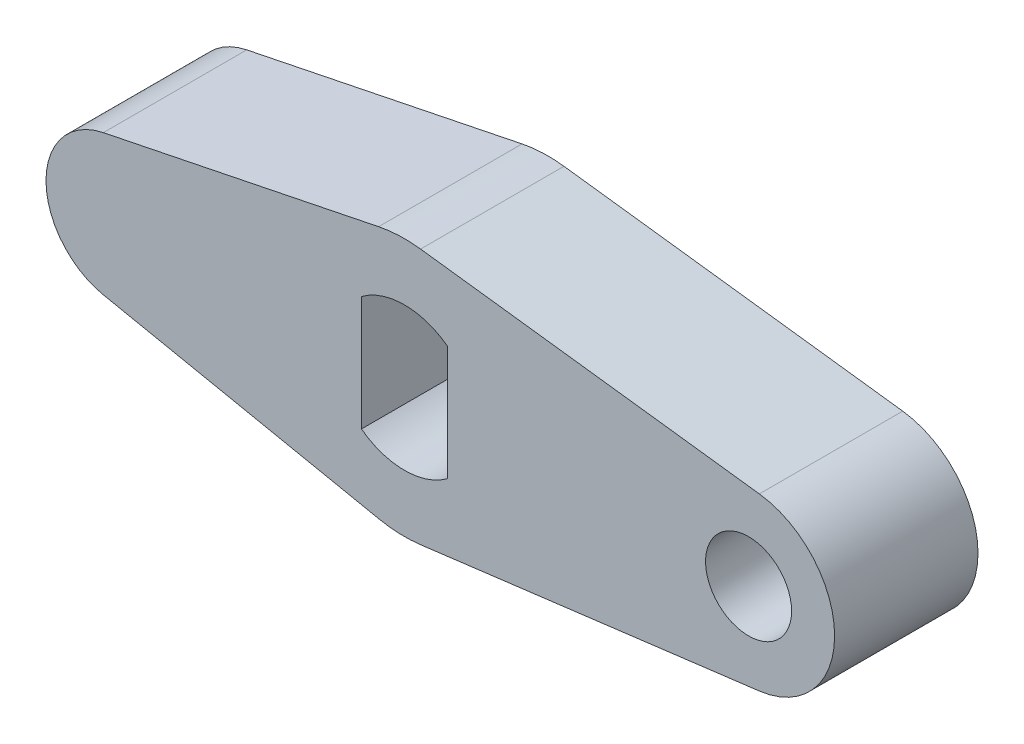
ISO-10303-21;
HEADER;
FILE_DESCRIPTION(('STEP AP214'),'2;1');
FILE_NAME('part.step','',(''),(''),'','','');
FILE_SCHEMA(('AUTOMOTIVE_DESIGN { 1 0 10303 214 1 1 1 1 }'));
ENDSEC;
DATA;
#1=APPLICATION_CONTEXT('core data for automotive mechanical design processes');
#2=APPLICATION_PROTOCOL_DEFINITION('international standard','automotive_design',2000,#1);
#3=PRODUCT_CONTEXT('',#1,'mechanical');
#4=PRODUCT('Part','Part','',(#3));
#5=PRODUCT_RELATED_PRODUCT_CATEGORY('part','',(#4));
#6=PRODUCT_DEFINITION_FORMATION('','',#4);
#7=PRODUCT_DEFINITION_CONTEXT('part definition',#1,'design');
#8=PRODUCT_DEFINITION('design','',#6,#7);
#9=PRODUCT_DEFINITION_SHAPE('','',#8);
#10=(LENGTH_UNIT() NAMED_UNIT(*) SI_UNIT(.MILLI.,.METRE.));
#11=(NAMED_UNIT(*) PLANE_ANGLE_UNIT() SI_UNIT($,.RADIAN.));
#12=(NAMED_UNIT(*) SI_UNIT($,.STERADIAN.) SOLID_ANGLE_UNIT());
#13=UNCERTAINTY_MEASURE_WITH_UNIT(LENGTH_MEASURE(1.E-05),#10,'distance_accuracy_value','');
#14=(GEOMETRIC_REPRESENTATION_CONTEXT(3) GLOBAL_UNCERTAINTY_ASSIGNED_CONTEXT((#13)) GLOBAL_UNIT_ASSIGNED_CONTEXT((#10,
#11,#12)) REPRESENTATION_CONTEXT('',''));
#15=CARTESIAN_POINT('',(0.,0.,0.));
#16=DIRECTION('',(0.,0.,1.));
#17=DIRECTION('',(1.,0.,0.));
#18=AXIS2_PLACEMENT_3D('',#15,#16,#17);
#19=CARTESIAN_POINT('',(-0.9,4.40908153700972,2.5));
#20=DIRECTION('',(0.2,-0.979795897113271,0.));
#21=DIRECTION('',(0.979795897113271,0.2,0.));
#22=AXIS2_PLACEMENT_3D('',#19,#20,#21);
#23=PLANE('',#22);
#24=DIRECTION('',(-0.979795897113271,-0.2,0.));
#25=VECTOR('',#24,1.);
#26=CARTESIAN_POINT('',(-0.9,4.40908153700972,-2.5));
#27=LINE('',#26,#25);
#28=CARTESIAN_POINT('',(-0.9,4.40908153700972,-2.5));
#29=VERTEX_POINT('',#28);
#30=CARTESIAN_POINT('',(-10.5,2.44948974278318,-2.5));
#31=VERTEX_POINT('',#30);
#32=EDGE_CURVE('E173',#29,#31,#27,.T.);
#33=ORIENTED_EDGE('',*,*,#32,.T.);
#34=DIRECTION('',(0.,0.,-1.));
#35=VECTOR('',#34,1.);
#36=CARTESIAN_POINT('',(-10.5,2.44948974278318,2.5));
#37=LINE('',#36,#35);
#38=CARTESIAN_POINT('',(-10.5,2.44948974278318,2.5));
#39=VERTEX_POINT('',#38);
#40=EDGE_CURVE('E11',#39,#31,#37,.T.);
#41=ORIENTED_EDGE('',*,*,#40,.F.);
#42=DIRECTION('',(-0.979795897113271,-0.2,0.));
#43=VECTOR('',#42,1.);
#44=CARTESIAN_POINT('',(-0.9,4.40908153700972,2.5));
#45=LINE('',#44,#43);
#46=CARTESIAN_POINT('',(-0.9,4.40908153700972,2.5));
#47=VERTEX_POINT('',#46);
#48=EDGE_CURVE('E290',#47,#39,#45,.T.);
#49=ORIENTED_EDGE('',*,*,#48,.F.);
#50=DIRECTION('',(0.,0.,-1.));
#51=VECTOR('',#50,1.);
#52=CARTESIAN_POINT('',(-0.9,4.40908153700972,2.5));
#53=LINE('',#52,#51);
#54=EDGE_CURVE('E193',#47,#29,#53,.T.);
#55=ORIENTED_EDGE('',*,*,#54,.T.);
#56=EDGE_LOOP('',(#33,#41,#49,#55));
#57=FACE_BOUND('',#56,.T.);
#58=ADVANCED_FACE('F35',(#57),#23,.F.);
#59=CARTESIAN_POINT('',(-10.,0.,2.5));
#60=DIRECTION('',(0.,0.,-1.));
#61=DIRECTION('',(-1.,0.,0.));
#62=AXIS2_PLACEMENT_3D('',#59,#60,#61);
#63=CYLINDRICAL_SURFACE('',#62,2.5);
#64=CARTESIAN_POINT('',(-10.,0.,-2.5));
#65=DIRECTION('',(0.,0.,1.));
#66=DIRECTION('',(1.,0.,0.));
#67=AXIS2_PLACEMENT_3D('',#64,#65,#66);
#68=CIRCLE('',#67,2.5);
#69=CARTESIAN_POINT('',(-10.5,-2.44948974278318,-2.5));
#70=VERTEX_POINT('',#69);
#71=EDGE_CURVE('E176',#31,#70,#68,.T.);
#72=ORIENTED_EDGE('',*,*,#71,.T.);
#73=DIRECTION('',(0.,0.,-1.));
#74=VECTOR('',#73,1.);
#75=CARTESIAN_POINT('',(-10.5,-2.44948974278318,2.5));
#76=LINE('',#75,#74);
#77=CARTESIAN_POINT('',(-10.5,-2.44948974278318,2.5));
#78=VERTEX_POINT('',#77);
#79=EDGE_CURVE('E45',#78,#70,#76,.T.);
#80=ORIENTED_EDGE('',*,*,#79,.F.);
#81=CARTESIAN_POINT('',(-10.,0.,2.5));
#82=DIRECTION('',(0.,0.,1.));
#83=DIRECTION('',(1.,0.,0.));
#84=AXIS2_PLACEMENT_3D('',#81,#82,#83);
#85=CIRCLE('',#84,2.5);
#86=EDGE_CURVE('E288',#39,#78,#85,.T.);
#87=ORIENTED_EDGE('',*,*,#86,.F.);
#88=ORIENTED_EDGE('',*,*,#40,.T.);
#89=EDGE_LOOP('',(#72,#80,#87,#88));
#90=FACE_BOUND('',#89,.T.);
#91=ADVANCED_FACE('F238',(#90),#63,.T.);
#92=CARTESIAN_POINT('',(-0.899999999999998,-4.40908153700972,2.5));
#93=DIRECTION('',(-0.2,-0.979795897113271,0.));
#94=DIRECTION('',(0.979795897113271,-0.2,0.));
#95=AXIS2_PLACEMENT_3D('',#92,#93,#94);
#96=PLANE('',#95);
#97=DIRECTION('',(-0.979795897113271,0.2,0.));
#98=VECTOR('',#97,1.);
#99=CARTESIAN_POINT('',(-0.899999999999998,-4.40908153700972,-2.5));
#100=LINE('',#99,#98);
#101=CARTESIAN_POINT('',(-0.899999999999999,-4.40908153700972,-2.5));
#102=VERTEX_POINT('',#101);
#103=EDGE_CURVE('E179',#102,#70,#100,.T.);
#104=ORIENTED_EDGE('',*,*,#103,.F.);
#105=DIRECTION('',(0.,0.,-1.));
#106=VECTOR('',#105,1.);
#107=CARTESIAN_POINT('',(-0.899999999999999,-4.40908153700972,2.5));
#108=LINE('',#107,#106);
#109=CARTESIAN_POINT('',(-0.899999999999999,-4.40908153700972,2.5));
#110=VERTEX_POINT('',#109);
#111=EDGE_CURVE('E200',#110,#102,#108,.T.);
#112=ORIENTED_EDGE('',*,*,#111,.F.);
#113=DIRECTION('',(-0.979795897113271,0.2,0.));
#114=VECTOR('',#113,1.);
#115=CARTESIAN_POINT('',(-0.899999999999998,-4.40908153700972,2.5));
#116=LINE('',#115,#114);
#117=EDGE_CURVE('E285',#110,#78,#116,.T.);
#118=ORIENTED_EDGE('',*,*,#117,.T.);
#119=ORIENTED_EDGE('',*,*,#79,.T.);
#120=EDGE_LOOP('',(#104,#112,#118,#119));
#121=FACE_BOUND('',#120,.T.);
#122=ADVANCED_FACE('F244',(#121),#96,.T.);
#123=CARTESIAN_POINT('',(0.,0.,2.5));
#124=DIRECTION('',(0.,0.,-1.));
#125=DIRECTION('',(-1.,0.,0.));
#126=AXIS2_PLACEMENT_3D('',#123,#124,#125);
#127=CYLINDRICAL_SURFACE('',#126,4.5);
#128=CARTESIAN_POINT('',(0.,0.,-2.5));
#129=DIRECTION('',(0.,0.,1.));
#130=DIRECTION('',(1.,0.,0.));
#131=AXIS2_PLACEMENT_3D('',#128,#129,#130);
#132=CIRCLE('',#131,4.5);
#133=CARTESIAN_POINT('',(0.5625,-4.4647053374215,-2.5));
#134=VERTEX_POINT('',#133);
#135=EDGE_CURVE('E182',#102,#134,#132,.T.);
#136=ORIENTED_EDGE('',*,*,#135,.T.);
#137=DIRECTION('',(0.,0.,-1.));
#138=VECTOR('',#137,1.);
#139=CARTESIAN_POINT('',(0.5625,-4.4647053374215,2.5));
#140=LINE('',#139,#138);
#141=CARTESIAN_POINT('',(0.5625,-4.4647053374215,2.5));
#142=VERTEX_POINT('',#141);
#143=EDGE_CURVE('E197',#142,#134,#140,.T.);
#144=ORIENTED_EDGE('',*,*,#143,.F.);
#145=CARTESIAN_POINT('',(0.,0.,2.5));
#146=DIRECTION('',(0.,0.,1.));
#147=DIRECTION('',(1.,0.,0.));
#148=AXIS2_PLACEMENT_3D('',#145,#146,#147);
#149=CIRCLE('',#148,4.5);
#150=EDGE_CURVE('E157',#110,#142,#149,.T.);
#151=ORIENTED_EDGE('',*,*,#150,.F.);
#152=ORIENTED_EDGE('',*,*,#111,.T.);
#153=EDGE_LOOP('',(#136,#144,#151,#152));
#154=FACE_BOUND('',#153,.T.);
#155=ADVANCED_FACE('F234',(#154),#127,.T.);
#156=CARTESIAN_POINT('',(0.5625,-4.4647053374215,2.5));
#157=DIRECTION('',(-0.125,0.992156741649222,0.));
#158=DIRECTION('',(-0.992156741649222,-0.125,0.));
#159=AXIS2_PLACEMENT_3D('',#156,#157,#158);
#160=PLANE('',#159);
#161=DIRECTION('',(0.992156741649222,0.125,0.));
#162=VECTOR('',#161,1.);
#163=CARTESIAN_POINT('',(0.5625,-4.4647053374215,-2.5));
#164=LINE('',#163,#162);
#165=CARTESIAN_POINT('',(12.375,-2.97647022494766,-2.5));
#166=VERTEX_POINT('',#165);
#167=EDGE_CURVE('E184',#134,#166,#164,.T.);
#168=ORIENTED_EDGE('',*,*,#167,.T.);
#169=DIRECTION('',(0.,0.,-1.));
#170=VECTOR('',#169,1.);
#171=CARTESIAN_POINT('',(12.375,-2.97647022494766,2.5));
#172=LINE('',#171,#170);
#173=CARTESIAN_POINT('',(12.375,-2.97647022494766,2.5));
#174=VERTEX_POINT('',#173);
#175=EDGE_CURVE('E151',#174,#166,#172,.T.);
#176=ORIENTED_EDGE('',*,*,#175,.F.);
#177=DIRECTION('',(0.992156741649222,0.125,0.));
#178=VECTOR('',#177,1.);
#179=CARTESIAN_POINT('',(0.5625,-4.4647053374215,2.5));
#180=LINE('',#179,#178);
#181=EDGE_CURVE('E138',#142,#174,#180,.T.);
#182=ORIENTED_EDGE('',*,*,#181,.F.);
#183=ORIENTED_EDGE('',*,*,#143,.T.);
#184=EDGE_LOOP('',(#168,#176,#182,#183));
#185=FACE_BOUND('',#184,.T.);
#186=ADVANCED_FACE('F267',(#185),#160,.F.);
#187=CARTESIAN_POINT('',(12.,0.,2.5));
#188=DIRECTION('',(0.,0.,-1.));
#189=DIRECTION('',(-1.,0.,0.));
#190=AXIS2_PLACEMENT_3D('',#187,#188,#189);
#191=CYLINDRICAL_SURFACE('',#190,2.99999999999999);
#192=CARTESIAN_POINT('',(12.,0.,-2.5));
#193=DIRECTION('',(0.,0.,1.));
#194=DIRECTION('',(1.,0.,0.));
#195=AXIS2_PLACEMENT_3D('',#192,#193,#194);
#196=CIRCLE('',#195,2.99999999999999);
#197=CARTESIAN_POINT('',(12.375,2.97647022494766,-2.5));
#198=VERTEX_POINT('',#197);
#199=EDGE_CURVE('E147',#166,#198,#196,.T.);
#200=ORIENTED_EDGE('',*,*,#199,.T.);
#201=DIRECTION('',(0.,0.,-1.));
#202=VECTOR('',#201,1.);
#203=CARTESIAN_POINT('',(12.375,2.97647022494766,2.5));
#204=LINE('',#203,#202);
#205=CARTESIAN_POINT('',(12.375,2.97647022494766,2.5));
#206=VERTEX_POINT('',#205);
#207=EDGE_CURVE('E144',#206,#198,#204,.T.);
#208=ORIENTED_EDGE('',*,*,#207,.F.);
#209=CARTESIAN_POINT('',(12.,0.,2.5));
#210=DIRECTION('',(0.,0.,1.));
#211=DIRECTION('',(1.,0.,0.));
#212=AXIS2_PLACEMENT_3D('',#209,#210,#211);
#213=CIRCLE('',#212,2.99999999999999);
#214=EDGE_CURVE('E131',#174,#206,#213,.T.);
#215=ORIENTED_EDGE('',*,*,#214,.F.);
#216=ORIENTED_EDGE('',*,*,#175,.T.);
#217=EDGE_LOOP('',(#200,#208,#215,#216));
#218=FACE_BOUND('',#217,.T.);
#219=ADVANCED_FACE('F145',(#218),#191,.T.);
#220=CARTESIAN_POINT('',(0.5625,4.4647053374215,2.5));
#221=DIRECTION('',(0.125,0.992156741649222,0.));
#222=DIRECTION('',(-0.992156741649222,0.125,0.));
#223=AXIS2_PLACEMENT_3D('',#220,#221,#222);
#224=PLANE('',#223);
#225=DIRECTION('',(0.992156741649222,-0.125,0.));
#226=VECTOR('',#225,1.);
#227=CARTESIAN_POINT('',(0.5625,4.4647053374215,-2.5));
#228=LINE('',#227,#226);
#229=CARTESIAN_POINT('',(0.5625,4.4647053374215,-2.5));
#230=VERTEX_POINT('',#229);
#231=EDGE_CURVE('E187',#230,#198,#228,.T.);
#232=ORIENTED_EDGE('',*,*,#231,.F.);
#233=DIRECTION('',(0.,0.,-1.));
#234=VECTOR('',#233,1.);
#235=CARTESIAN_POINT('',(0.5625,4.4647053374215,2.5));
#236=LINE('',#235,#234);
#237=CARTESIAN_POINT('',(0.5625,4.4647053374215,2.5));
#238=VERTEX_POINT('',#237);
#239=EDGE_CURVE('E94',#238,#230,#236,.T.);
#240=ORIENTED_EDGE('',*,*,#239,.F.);
#241=DIRECTION('',(0.992156741649222,-0.125,0.));
#242=VECTOR('',#241,1.);
#243=CARTESIAN_POINT('',(0.5625,4.4647053374215,2.5));
#244=LINE('',#243,#242);
#245=EDGE_CURVE('E136',#238,#206,#244,.T.);
#246=ORIENTED_EDGE('',*,*,#245,.T.);
#247=ORIENTED_EDGE('',*,*,#207,.T.);
#248=EDGE_LOOP('',(#232,#240,#246,#247));
#249=FACE_BOUND('',#248,.T.);
#250=ADVANCED_FACE('F153',(#249),#224,.T.);
#251=CARTESIAN_POINT('',(0.,0.,2.5));
#252=DIRECTION('',(0.,0.,-1.));
#253=DIRECTION('',(-1.,0.,0.));
#254=AXIS2_PLACEMENT_3D('',#251,#252,#253);
#255=CYLINDRICAL_SURFACE('',#254,2.5);
#256=CARTESIAN_POINT('',(0.,0.,-2.5));
#257=DIRECTION('',(0.,0.,1.));
#258=DIRECTION('',(1.,0.,0.));
#259=AXIS2_PLACEMENT_3D('',#256,#257,#258);
#260=CIRCLE('',#259,2.5);
#261=CARTESIAN_POINT('',(1.5,2.,-2.5));
#262=VERTEX_POINT('',#261);
#263=CARTESIAN_POINT('',(-1.5,2.,-2.5));
#264=VERTEX_POINT('',#263);
#265=EDGE_CURVE('E163',#262,#264,#260,.T.);
#266=ORIENTED_EDGE('',*,*,#265,.F.);
#267=DIRECTION('',(0.,0.,-1.));
#268=VECTOR('',#267,1.);
#269=CARTESIAN_POINT('',(1.5,2.,2.5));
#270=LINE('',#269,#268);
#271=CARTESIAN_POINT('',(1.5,2.,2.5));
#272=VERTEX_POINT('',#271);
#273=EDGE_CURVE('E39',#272,#262,#270,.T.);
#274=ORIENTED_EDGE('',*,*,#273,.F.);
#275=CARTESIAN_POINT('',(0.,0.,2.5));
#276=DIRECTION('',(0.,0.,1.));
#277=DIRECTION('',(1.,0.,0.));
#278=AXIS2_PLACEMENT_3D('',#275,#276,#277);
#279=CIRCLE('',#278,2.5);
#280=CARTESIAN_POINT('',(-1.5,2.,2.5));
#281=VERTEX_POINT('',#280);
#282=EDGE_CURVE('E192',#272,#281,#279,.T.);
#283=ORIENTED_EDGE('',*,*,#282,.T.);
#284=DIRECTION('',(0.,0.,-1.));
#285=VECTOR('',#284,1.);
#286=CARTESIAN_POINT('',(-1.5,2.,2.5));
#287=LINE('',#286,#285);
#288=EDGE_CURVE('E162',#281,#264,#287,.T.);
#289=ORIENTED_EDGE('',*,*,#288,.T.);
#290=EDGE_LOOP('',(#266,#274,#283,#289));
#291=FACE_BOUND('',#290,.T.);
#292=ADVANCED_FACE('F219',(#291),#255,.F.);
#293=CARTESIAN_POINT('',(1.5,0.,2.5));
#294=DIRECTION('',(1.,0.,0.));
#295=DIRECTION('',(0.,0.,-1.));
#296=AXIS2_PLACEMENT_3D('',#293,#294,#295);
#297=PLANE('',#296);
#298=DIRECTION('',(0.,-1.,0.));
#299=VECTOR('',#298,1.);
#300=CARTESIAN_POINT('',(1.5,0.,-2.5));
#301=LINE('',#300,#299);
#302=CARTESIAN_POINT('',(1.5,-2.,-2.5));
#303=VERTEX_POINT('',#302);
#304=EDGE_CURVE('E166',#262,#303,#301,.T.);
#305=ORIENTED_EDGE('',*,*,#304,.T.);
#306=DIRECTION('',(0.,0.,-1.));
#307=VECTOR('',#306,1.);
#308=CARTESIAN_POINT('',(1.5,-2.,2.5));
#309=LINE('',#308,#307);
#310=CARTESIAN_POINT('',(1.5,-2.,2.5));
#311=VERTEX_POINT('',#310);
#312=EDGE_CURVE('E205',#311,#303,#309,.T.);
#313=ORIENTED_EDGE('',*,*,#312,.F.);
#314=DIRECTION('',(0.,-1.,0.));
#315=VECTOR('',#314,1.);
#316=CARTESIAN_POINT('',(1.5,0.,2.5));
#317=LINE('',#316,#315);
#318=EDGE_CURVE('E213',#272,#311,#317,.T.);
#319=ORIENTED_EDGE('',*,*,#318,.F.);
#320=ORIENTED_EDGE('',*,*,#273,.T.);
#321=EDGE_LOOP('',(#305,#313,#319,#320));
#322=FACE_BOUND('',#321,.T.);
#323=ADVANCED_FACE('F37',(#322),#297,.F.);
#324=CARTESIAN_POINT('',(-1.5,-2.,-2.5));
#325=VERTEX_POINT('',#324);
#326=EDGE_CURVE('E167',#325,#303,#260,.T.);
#327=ORIENTED_EDGE('',*,*,#326,.F.);
#328=DIRECTION('',(0.,0.,-1.));
#329=VECTOR('',#328,1.);
#330=CARTESIAN_POINT('',(-1.5,-2.,2.5));
#331=LINE('',#330,#329);
#332=CARTESIAN_POINT('',(-1.5,-2.,2.5));
#333=VERTEX_POINT('',#332);
#334=EDGE_CURVE('E204',#333,#325,#331,.T.);
#335=ORIENTED_EDGE('',*,*,#334,.F.);
#336=EDGE_CURVE('E293',#333,#311,#279,.T.);
#337=ORIENTED_EDGE('',*,*,#336,.T.);
#338=ORIENTED_EDGE('',*,*,#312,.T.);
#339=EDGE_LOOP('',(#327,#335,#337,#338));
#340=FACE_BOUND('',#339,.T.);
#341=ADVANCED_FACE('F226',(#340),#255,.F.);
#342=EDGE_CURVE('E97',#230,#29,#132,.T.);
#343=ORIENTED_EDGE('',*,*,#342,.T.);
#344=ORIENTED_EDGE('',*,*,#54,.F.);
#345=EDGE_CURVE('E54',#238,#47,#149,.T.);
#346=ORIENTED_EDGE('',*,*,#345,.F.);
#347=ORIENTED_EDGE('',*,*,#239,.T.);
#348=EDGE_LOOP('',(#343,#344,#346,#347));
#349=FACE_BOUND('',#348,.T.);
#350=ADVANCED_FACE('F228',(#349),#127,.T.);
#351=CARTESIAN_POINT('',(-1.5,0.,2.5));
#352=DIRECTION('',(1.,0.,0.));
#353=DIRECTION('',(0.,0.,-1.));
#354=AXIS2_PLACEMENT_3D('',#351,#352,#353);
#355=PLANE('',#354);
#356=DIRECTION('',(0.,-1.,0.));
#357=VECTOR('',#356,1.);
#358=CARTESIAN_POINT('',(-1.5,0.,-2.5));
#359=LINE('',#358,#357);
#360=EDGE_CURVE('E170',#264,#325,#359,.T.);
#361=ORIENTED_EDGE('',*,*,#360,.F.);
#362=ORIENTED_EDGE('',*,*,#288,.F.);
#363=DIRECTION('',(0.,-1.,0.));
#364=VECTOR('',#363,1.);
#365=CARTESIAN_POINT('',(-1.5,0.,2.5));
#366=LINE('',#365,#364);
#367=EDGE_CURVE('E224',#281,#333,#366,.T.);
#368=ORIENTED_EDGE('',*,*,#367,.T.);
#369=ORIENTED_EDGE('',*,*,#334,.T.);
#370=EDGE_LOOP('',(#361,#362,#368,#369));
#371=FACE_BOUND('',#370,.T.);
#372=ADVANCED_FACE('F223',(#371),#355,.T.);
#373=CARTESIAN_POINT('',(12.,0.,2.5));
#374=DIRECTION('',(0.,0.,-1.));
#375=DIRECTION('',(-1.,0.,0.));
#376=AXIS2_PLACEMENT_3D('',#373,#374,#375);
#377=CYLINDRICAL_SURFACE('',#376,1.5);
#378=CARTESIAN_POINT('',(12.,0.,2.5));
#379=DIRECTION('',(0.,0.,1.));
#380=DIRECTION('',(1.,0.,0.));
#381=AXIS2_PLACEMENT_3D('',#378,#379,#380);
#382=CIRCLE('',#381,1.5);
#383=CARTESIAN_POINT('',(13.5,0.,2.5));
#384=VERTEX_POINT('',#383);
#385=EDGE_CURVE('E155',#384,#384,#382,.T.);
#386=ORIENTED_EDGE('',*,*,#385,.T.);
#387=EDGE_LOOP('',(#386));
#388=FACE_BOUND('',#387,.T.);
#389=CARTESIAN_POINT('',(12.,0.,-2.5));
#390=DIRECTION('',(0.,0.,1.));
#391=DIRECTION('',(1.,0.,0.));
#392=AXIS2_PLACEMENT_3D('',#389,#390,#391);
#393=CIRCLE('',#392,1.5);
#394=CARTESIAN_POINT('',(13.5,0.,-2.5));
#395=VERTEX_POINT('',#394);
#396=EDGE_CURVE('E189',#395,#395,#393,.T.);
#397=ORIENTED_EDGE('',*,*,#396,.F.);
#398=EDGE_LOOP('',(#397));
#399=FACE_BOUND('',#398,.T.);
#400=ADVANCED_FACE('F249',(#388,#399),#377,.F.);
#401=CARTESIAN_POINT('',(0.,0.,2.5));
#402=DIRECTION('',(0.,0.,1.));
#403=DIRECTION('',(1.,0.,0.));
#404=AXIS2_PLACEMENT_3D('',#401,#402,#403);
#405=PLANE('',#404);
#406=ORIENTED_EDGE('',*,*,#282,.F.);
#407=ORIENTED_EDGE('',*,*,#318,.T.);
#408=ORIENTED_EDGE('',*,*,#336,.F.);
#409=ORIENTED_EDGE('',*,*,#367,.F.);
#410=EDGE_LOOP('',(#406,#407,#408,#409));
#411=FACE_BOUND('',#410,.T.);
#412=ORIENTED_EDGE('',*,*,#48,.T.);
#413=ORIENTED_EDGE('',*,*,#86,.T.);
#414=ORIENTED_EDGE('',*,*,#117,.F.);
#415=ORIENTED_EDGE('',*,*,#150,.T.);
#416=ORIENTED_EDGE('',*,*,#181,.T.);
#417=ORIENTED_EDGE('',*,*,#214,.T.);
#418=ORIENTED_EDGE('',*,*,#245,.F.);
#419=ORIENTED_EDGE('',*,*,#345,.T.);
#420=EDGE_LOOP('',(#412,#413,#414,#415,#416,#417,#418,#419));
#421=FACE_BOUND('',#420,.T.);
#422=ORIENTED_EDGE('',*,*,#385,.F.);
#423=EDGE_LOOP('',(#422));
#424=FACE_BOUND('',#423,.T.);
#425=ADVANCED_FACE('F133',(#411,#421,#424),#405,.T.);
#426=CARTESIAN_POINT('',(0.,0.,-2.5));
#427=DIRECTION('',(0.,0.,1.));
#428=DIRECTION('',(1.,0.,0.));
#429=AXIS2_PLACEMENT_3D('',#426,#427,#428);
#430=PLANE('',#429);
#431=ORIENTED_EDGE('',*,*,#265,.T.);
#432=ORIENTED_EDGE('',*,*,#360,.T.);
#433=ORIENTED_EDGE('',*,*,#326,.T.);
#434=ORIENTED_EDGE('',*,*,#304,.F.);
#435=EDGE_LOOP('',(#431,#432,#433,#434));
#436=FACE_BOUND('',#435,.T.);
#437=ORIENTED_EDGE('',*,*,#32,.F.);
#438=ORIENTED_EDGE('',*,*,#342,.F.);
#439=ORIENTED_EDGE('',*,*,#231,.T.);
#440=ORIENTED_EDGE('',*,*,#199,.F.);
#441=ORIENTED_EDGE('',*,*,#167,.F.);
#442=ORIENTED_EDGE('',*,*,#135,.F.);
#443=ORIENTED_EDGE('',*,*,#103,.T.);
#444=ORIENTED_EDGE('',*,*,#71,.F.);
#445=EDGE_LOOP('',(#437,#438,#439,#440,#441,#442,#443,#444));
#446=FACE_BOUND('',#445,.T.);
#447=ORIENTED_EDGE('',*,*,#396,.T.);
#448=EDGE_LOOP('',(#447));
#449=FACE_BOUND('',#448,.T.);
#450=ADVANCED_FACE('F216',(#436,#446,#449),#430,.F.);
#451=CLOSED_SHELL('',(#58,#91,#122,#155,#186,#219,#250,#292,#323,#341,#350,#372,#400,#425,#450));
#452=MANIFOLD_SOLID_BREP('B2',#451);
#453=ADVANCED_BREP_SHAPE_REPRESENTATION('',(#18,#452),#14);
#454=SHAPE_DEFINITION_REPRESENTATION(#9,#453);
ENDSEC;
END-ISO-10303-21;
